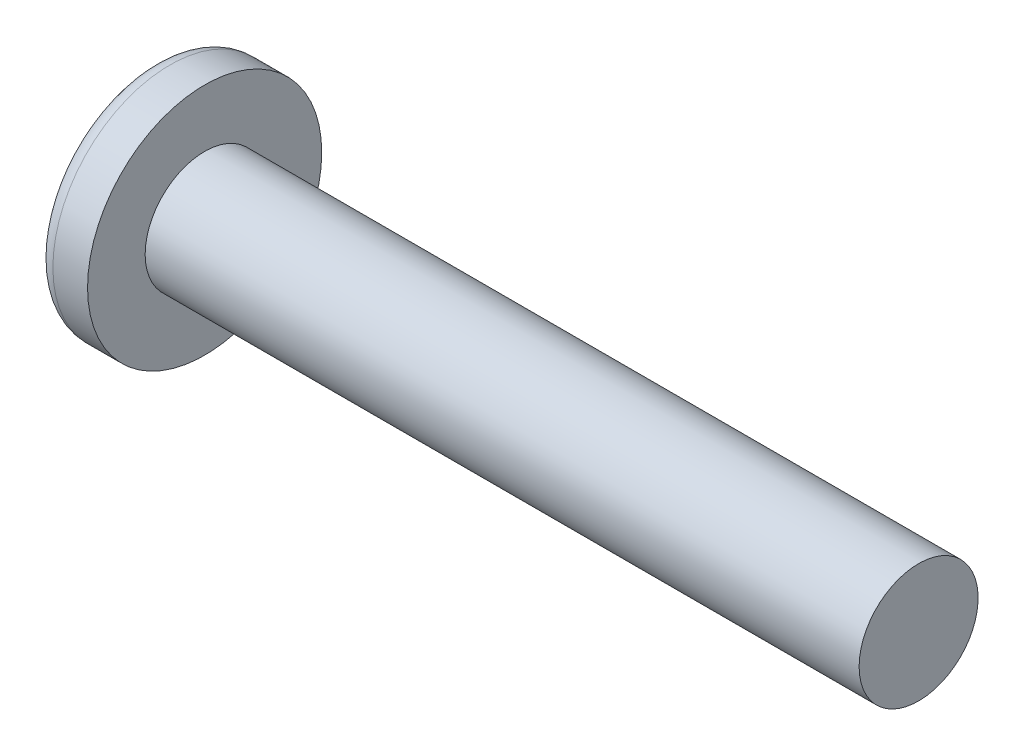
ISO-10303-21;
HEADER;
FILE_DESCRIPTION(('STEP AP214'),'2;1');
FILE_NAME('part.step','',(''),(''),'','','');
FILE_SCHEMA(('AUTOMOTIVE_DESIGN { 1 0 10303 214 1 1 1 1 }'));
ENDSEC;
DATA;
#1=APPLICATION_CONTEXT('core data for automotive mechanical design processes');
#2=APPLICATION_PROTOCOL_DEFINITION('international standard','automotive_design',2000,#1);
#3=PRODUCT_CONTEXT('',#1,'mechanical');
#4=PRODUCT('Part','Part','',(#3));
#5=PRODUCT_RELATED_PRODUCT_CATEGORY('part','',(#4));
#6=PRODUCT_DEFINITION_FORMATION('','',#4);
#7=PRODUCT_DEFINITION_CONTEXT('part definition',#1,'design');
#8=PRODUCT_DEFINITION('design','',#6,#7);
#9=PRODUCT_DEFINITION_SHAPE('','',#8);
#10=(LENGTH_UNIT() NAMED_UNIT(*) SI_UNIT(.MILLI.,.METRE.));
#11=(NAMED_UNIT(*) PLANE_ANGLE_UNIT() SI_UNIT($,.RADIAN.));
#12=(NAMED_UNIT(*) SI_UNIT($,.STERADIAN.) SOLID_ANGLE_UNIT());
#13=UNCERTAINTY_MEASURE_WITH_UNIT(LENGTH_MEASURE(1.E-05),#10,'distance_accuracy_value','');
#14=(GEOMETRIC_REPRESENTATION_CONTEXT(3) GLOBAL_UNCERTAINTY_ASSIGNED_CONTEXT((#13)) GLOBAL_UNIT_ASSIGNED_CONTEXT((#10,
#11,#12)) REPRESENTATION_CONTEXT('',''));
#15=CARTESIAN_POINT('',(0.,0.,0.));
#16=DIRECTION('',(0.,0.,1.));
#17=DIRECTION('',(1.,0.,0.));
#18=AXIS2_PLACEMENT_3D('',#15,#16,#17);
#19=CARTESIAN_POINT('',(10.1599999999999,0.,0.));
#20=DIRECTION('',(-1.,0.,0.));
#21=DIRECTION('',(0.,1.,0.));
#22=AXIS2_PLACEMENT_3D('',#19,#20,#21);
#23=SPHERICAL_SURFACE('',#22,10.16);
#24=CARTESIAN_POINT('',(1.8696580223605,0.,0.));
#25=DIRECTION('',(-1.,0.,0.));
#26=DIRECTION('',(0.,0.,1.));
#27=AXIS2_PLACEMENT_3D('',#24,#25,#26);
#28=CIRCLE('',#27,5.87331506849315);
#29=CARTESIAN_POINT('',(1.8696580223605,0.,5.87331506849315));
#30=VERTEX_POINT('',#29);
#31=EDGE_CURVE('E174',#30,#30,#28,.T.);
#32=ORIENTED_EDGE('',*,*,#31,.T.);
#33=EDGE_LOOP('',(#32));
#34=FACE_BOUND('',#33,.T.);
#35=CARTESIAN_POINT('',(10.1534494829081,-0.0813167639009404,0.));
#36=DIRECTION('',(-0.0802954503227799,-0.996771107455198,0.));
#37=DIRECTION('',(0.996771107455198,-0.0802954503227799,0.));
#38=AXIS2_PLACEMENT_3D('',#35,#36,#37);
#39=CIRCLE('',#38,10.159672468866);
#40=CARTESIAN_POINT('',(0.652039536999327,0.684074592852801,3.51515714946449));
#41=VERTEX_POINT('',#40);
#42=CARTESIAN_POINT('',(0.0529249432221768,0.732336601796002,0.732336601795947));
#43=VERTEX_POINT('',#42);
#44=EDGE_CURVE('E205',#41,#43,#39,.T.);
#45=ORIENTED_EDGE('',*,*,#44,.F.);
#46=CARTESIAN_POINT('',(8.14988642132874,0.,-2.50394771045559));
#47=DIRECTION('',(0.626014972056276,0.,0.779811037855569));
#48=DIRECTION('',(0.779811037855569,0.,-0.626014972056276));
#49=AXIS2_PLACEMENT_3D('',#46,#47,#48);
#50=CIRCLE('',#49,9.63925771333798);
#51=CARTESIAN_POINT('',(0.652039536999327,-0.684074592852857,3.51515714946449));
#52=VERTEX_POINT('',#51);
#53=EDGE_CURVE('E170',#41,#52,#50,.T.);
#54=ORIENTED_EDGE('',*,*,#53,.T.);
#55=CARTESIAN_POINT('',(10.1534494829081,0.0813167639009404,0.));
#56=DIRECTION('',(-0.0802954503227798,0.996771107455198,0.));
#57=DIRECTION('',(-0.996771107455198,-0.0802954503227798,0.));
#58=AXIS2_PLACEMENT_3D('',#55,#56,#57);
#59=CIRCLE('',#58,10.159672468866);
#60=CARTESIAN_POINT('',(0.0529249432221768,-0.732336601796002,0.732336601795947));
#61=VERTEX_POINT('',#60);
#62=EDGE_CURVE('E126',#61,#52,#59,.T.);
#63=ORIENTED_EDGE('',*,*,#62,.F.);
#64=CARTESIAN_POINT('',(10.1534494829081,0.,-0.0813167639008849));
#65=DIRECTION('',(-0.0802954503227798,0.,-0.996771107455198));
#66=DIRECTION('',(-0.996771107455198,0.,0.0802954503227798));
#67=AXIS2_PLACEMENT_3D('',#64,#65,#66);
#68=CIRCLE('',#67,10.159672468866);
#69=CARTESIAN_POINT('',(0.652039536999327,-3.51515714946438,0.68407459285269));
#70=VERTEX_POINT('',#69);
#71=EDGE_CURVE('E151',#70,#61,#68,.T.);
#72=ORIENTED_EDGE('',*,*,#71,.F.);
#73=CARTESIAN_POINT('',(8.14988642132874,2.50394771045559,0.));
#74=DIRECTION('',(0.626014972056276,-0.779811037855569,0.));
#75=DIRECTION('',(0.779811037855569,0.626014972056276,0.));
#76=AXIS2_PLACEMENT_3D('',#73,#74,#75);
#77=CIRCLE('',#76,9.63925771333798);
#78=CARTESIAN_POINT('',(0.652039536999327,-3.51515714946438,-0.68407459285269));
#79=VERTEX_POINT('',#78);
#80=EDGE_CURVE('E159',#70,#79,#77,.T.);
#81=ORIENTED_EDGE('',*,*,#80,.T.);
#82=CARTESIAN_POINT('',(10.1534494829081,0.,0.0813167639008849));
#83=DIRECTION('',(-0.0802954503227799,0.,0.996771107455198));
#84=DIRECTION('',(0.996771107455198,0.,0.0802954503227799));
#85=AXIS2_PLACEMENT_3D('',#82,#83,#84);
#86=CIRCLE('',#85,10.159672468866);
#87=CARTESIAN_POINT('',(0.0529249432221768,-0.732336601796002,-0.732336601795947));
#88=VERTEX_POINT('',#87);
#89=EDGE_CURVE('E69',#88,#79,#86,.T.);
#90=ORIENTED_EDGE('',*,*,#89,.F.);
#91=CARTESIAN_POINT('',(0.652039536999327,-0.684074592852801,-3.51515714946449));
#92=VERTEX_POINT('',#91);
#93=EDGE_CURVE('E212',#92,#88,#59,.T.);
#94=ORIENTED_EDGE('',*,*,#93,.F.);
#95=CARTESIAN_POINT('',(8.14988642132874,0.,2.50394771045559));
#96=DIRECTION('',(0.626014972056276,0.,-0.779811037855569));
#97=DIRECTION('',(-0.779811037855569,0.,-0.626014972056276));
#98=AXIS2_PLACEMENT_3D('',#95,#96,#97);
#99=CIRCLE('',#98,9.63925771333798);
#100=CARTESIAN_POINT('',(0.652039536999327,0.684074592852857,-3.51515714946449));
#101=VERTEX_POINT('',#100);
#102=EDGE_CURVE('E152',#92,#101,#99,.T.);
#103=ORIENTED_EDGE('',*,*,#102,.T.);
#104=CARTESIAN_POINT('',(0.0529249432221768,0.732336601796002,-0.732336601795947));
#105=VERTEX_POINT('',#104);
#106=EDGE_CURVE('E200',#105,#101,#39,.T.);
#107=ORIENTED_EDGE('',*,*,#106,.F.);
#108=CARTESIAN_POINT('',(0.652039536999327,3.51515714946438,-0.68407459285269));
#109=VERTEX_POINT('',#108);
#110=EDGE_CURVE('E62',#109,#105,#86,.T.);
#111=ORIENTED_EDGE('',*,*,#110,.F.);
#112=CARTESIAN_POINT('',(8.14988642132874,-2.50394771045559,0.));
#113=DIRECTION('',(0.626014972056276,0.779811037855569,0.));
#114=DIRECTION('',(-0.779811037855569,0.626014972056276,0.));
#115=AXIS2_PLACEMENT_3D('',#112,#113,#114);
#116=CIRCLE('',#115,9.63925771333798);
#117=CARTESIAN_POINT('',(0.652039536999327,3.51515714946438,0.68407459285269));
#118=VERTEX_POINT('',#117);
#119=EDGE_CURVE('E13',#109,#118,#116,.T.);
#120=ORIENTED_EDGE('',*,*,#119,.T.);
#121=EDGE_CURVE('E188',#43,#118,#68,.T.);
#122=ORIENTED_EDGE('',*,*,#121,.F.);
#123=EDGE_LOOP('',(#45,#54,#63,#72,#81,#90,#94,#103,#107,#111,#120,#122));
#124=FACE_BOUND('',#123,.T.);
#125=ADVANCED_FACE('F54',(#34,#124),#23,.T.);
#126=CARTESIAN_POINT('',(5.03078200692042,0.,-0.33134256055356));
#127=DIRECTION('',(-0.0802954503227799,0.,0.996771107455198));
#128=DIRECTION('',(0.996771107455198,0.,0.0802954503227799));
#129=AXIS2_PLACEMENT_3D('',#126,#127,#128);
#130=PLANE('',#129);
#131=ORIENTED_EDGE('',*,*,#110,.T.);
#132=DIRECTION('',(0.993573291519185,-0.0800378484834902,0.08003784848349));
#133=VECTOR('',#132,1.);
#134=CARTESIAN_POINT('',(5.05713151661857,0.329219961161309,-0.329219961161309));
#135=LINE('',#134,#133);
#136=CARTESIAN_POINT('',(4.57200000000002,0.368299999999988,-0.368300000000099));
#137=VERTEX_POINT('',#136);
#138=EDGE_CURVE('E194',#105,#137,#135,.T.);
#139=ORIENTED_EDGE('',*,*,#138,.T.);
#140=DIRECTION('',(0.778276964525241,-0.624783452077207,0.0626945332534222));
#141=VECTOR('',#140,1.);
#142=CARTESIAN_POINT('',(0.,4.0386,-0.736599999999976));
#143=LINE('',#142,#141);
#144=EDGE_CURVE('E175',#109,#137,#143,.T.);
#145=ORIENTED_EDGE('',*,*,#144,.F.);
#146=EDGE_LOOP('',(#131,#139,#145));
#147=FACE_BOUND('',#146,.T.);
#148=ADVANCED_FACE('F193',(#147),#130,.T.);
#149=DIRECTION('',(0.778276964525241,0.624783452077207,0.0626945332534222));
#150=VECTOR('',#149,1.);
#151=CARTESIAN_POINT('',(0.,-4.0386,-0.736599999999976));
#152=LINE('',#151,#150);
#153=CARTESIAN_POINT('',(4.57200000000002,-0.368299999999988,-0.368300000000099));
#154=VERTEX_POINT('',#153);
#155=EDGE_CURVE('E160',#79,#154,#152,.T.);
#156=ORIENTED_EDGE('',*,*,#155,.T.);
#157=DIRECTION('',(-0.993573291519185,-0.0800378484834896,-0.08003784848349));
#158=VECTOR('',#157,1.);
#159=CARTESIAN_POINT('',(5.05713151661857,-0.329219961161309,-0.329219961161309));
#160=LINE('',#159,#158);
#161=EDGE_CURVE('E215',#154,#88,#160,.T.);
#162=ORIENTED_EDGE('',*,*,#161,.T.);
#163=ORIENTED_EDGE('',*,*,#89,.T.);
#164=EDGE_LOOP('',(#156,#162,#163));
#165=FACE_BOUND('',#164,.T.);
#166=ADVANCED_FACE('F230',(#165),#130,.T.);
#167=CARTESIAN_POINT('',(5.03078200692042,0.,0.33134256055356));
#168=DIRECTION('',(-0.0802954503227798,0.,-0.996771107455198));
#169=DIRECTION('',(-0.996771107455198,0.,0.0802954503227798));
#170=AXIS2_PLACEMENT_3D('',#167,#168,#169);
#171=PLANE('',#170);
#172=DIRECTION('',(0.778276964525241,-0.624783452077207,-0.0626945332534223));
#173=VECTOR('',#172,1.);
#174=CARTESIAN_POINT('',(0.,4.0386,0.736599999999976));
#175=LINE('',#174,#173);
#176=CARTESIAN_POINT('',(4.57200000000002,0.368299999999988,0.368300000000099));
#177=VERTEX_POINT('',#176);
#178=EDGE_CURVE('E231',#118,#177,#175,.T.);
#179=ORIENTED_EDGE('',*,*,#178,.T.);
#180=DIRECTION('',(-0.993573291519185,0.0800378484834897,0.0800378484834899));
#181=VECTOR('',#180,1.);
#182=CARTESIAN_POINT('',(5.05713151661857,0.329219961161309,0.329219961161309));
#183=LINE('',#182,#181);
#184=EDGE_CURVE('E209',#177,#43,#183,.T.);
#185=ORIENTED_EDGE('',*,*,#184,.T.);
#186=ORIENTED_EDGE('',*,*,#121,.T.);
#187=EDGE_LOOP('',(#179,#185,#186));
#188=FACE_BOUND('',#187,.T.);
#189=ADVANCED_FACE('F235',(#188),#171,.T.);
#190=ORIENTED_EDGE('',*,*,#71,.T.);
#191=DIRECTION('',(0.993573291519185,0.0800378484834902,-0.0800378484834899));
#192=VECTOR('',#191,1.);
#193=CARTESIAN_POINT('',(5.05713151661857,-0.329219961161309,0.329219961161309));
#194=LINE('',#193,#192);
#195=CARTESIAN_POINT('',(4.57200000000002,-0.368299999999988,0.368300000000099));
#196=VERTEX_POINT('',#195);
#197=EDGE_CURVE('E124',#61,#196,#194,.T.);
#198=ORIENTED_EDGE('',*,*,#197,.T.);
#199=DIRECTION('',(0.778276964525241,0.624783452077207,-0.0626945332534221));
#200=VECTOR('',#199,1.);
#201=CARTESIAN_POINT('',(0.,-4.0386,0.736599999999976));
#202=LINE('',#201,#200);
#203=EDGE_CURVE('E149',#70,#196,#202,.T.);
#204=ORIENTED_EDGE('',*,*,#203,.F.);
#205=EDGE_LOOP('',(#190,#198,#204));
#206=FACE_BOUND('',#205,.T.);
#207=ADVANCED_FACE('F148',(#206),#171,.T.);
#208=CARTESIAN_POINT('',(-25.4000000000001,0.,0.));
#209=DIRECTION('',(-1.,0.,0.));
#210=DIRECTION('',(0.,0.,1.));
#211=AXIS2_PLACEMENT_3D('',#208,#209,#210);
#212=CYLINDRICAL_SURFACE('',#211,3.175);
#213=CARTESIAN_POINT('',(42.5450000000001,0.,0.));
#214=DIRECTION('',(-1.,0.,0.));
#215=DIRECTION('',(0.,0.,1.));
#216=AXIS2_PLACEMENT_3D('',#213,#214,#215);
#217=CIRCLE('',#216,3.175);
#218=CARTESIAN_POINT('',(42.5450000000001,0.,3.175));
#219=VERTEX_POINT('',#218);
#220=EDGE_CURVE('E171',#219,#219,#217,.T.);
#221=ORIENTED_EDGE('',*,*,#220,.T.);
#222=EDGE_LOOP('',(#221));
#223=FACE_BOUND('',#222,.T.);
#224=CARTESIAN_POINT('',(4.44500000000003,0.,0.));
#225=DIRECTION('',(-1.,0.,0.));
#226=DIRECTION('',(0.,0.,1.));
#227=AXIS2_PLACEMENT_3D('',#224,#225,#226);
#228=CIRCLE('',#227,3.175);
#229=CARTESIAN_POINT('',(4.44500000000003,0.,3.175));
#230=VERTEX_POINT('',#229);
#231=EDGE_CURVE('E184',#230,#230,#228,.T.);
#232=ORIENTED_EDGE('',*,*,#231,.F.);
#233=EDGE_LOOP('',(#232));
#234=FACE_BOUND('',#233,.T.);
#235=ADVANCED_FACE('F56',(#223,#234),#212,.T.);
#236=CARTESIAN_POINT('',(4.44500000000003,3.17499999999998,0.));
#237=DIRECTION('',(-1.,0.,0.));
#238=DIRECTION('',(0.,0.,1.));
#239=AXIS2_PLACEMENT_3D('',#236,#237,#238);
#240=PLANE('',#239);
#241=CARTESIAN_POINT('',(4.44500000000003,0.,0.));
#242=DIRECTION('',(-1.,0.,0.));
#243=DIRECTION('',(0.,0.,1.));
#244=AXIS2_PLACEMENT_3D('',#241,#242,#243);
#245=CIRCLE('',#244,6.2484);
#246=CARTESIAN_POINT('',(4.44500000000003,0.,6.2484));
#247=VERTEX_POINT('',#246);
#248=EDGE_CURVE('E181',#247,#247,#245,.T.);
#249=ORIENTED_EDGE('',*,*,#248,.F.);
#250=EDGE_LOOP('',(#249));
#251=FACE_BOUND('',#250,.T.);
#252=ORIENTED_EDGE('',*,*,#231,.T.);
#253=EDGE_LOOP('',(#252));
#254=FACE_BOUND('',#253,.T.);
#255=ADVANCED_FACE('F263',(#251,#254),#240,.F.);
#256=CARTESIAN_POINT('',(-25.4000000000001,0.,0.));
#257=DIRECTION('',(-1.,0.,0.));
#258=DIRECTION('',(0.,0.,1.));
#259=AXIS2_PLACEMENT_3D('',#256,#257,#258);
#260=CYLINDRICAL_SURFACE('',#259,6.2484);
#261=ORIENTED_EDGE('',*,*,#248,.T.);
#262=EDGE_LOOP('',(#261));
#263=FACE_BOUND('',#262,.T.);
#264=CARTESIAN_POINT('',(2.5950629454039,0.,0.));
#265=DIRECTION('',(-1.,0.,0.));
#266=DIRECTION('',(0.,0.,1.));
#267=AXIS2_PLACEMENT_3D('',#264,#265,#266);
#268=CIRCLE('',#267,6.2484);
#269=CARTESIAN_POINT('',(2.5950629454039,0.,6.2484));
#270=VERTEX_POINT('',#269);
#271=EDGE_CURVE('E178',#270,#270,#268,.T.);
#272=ORIENTED_EDGE('',*,*,#271,.F.);
#273=EDGE_LOOP('',(#272));
#274=FACE_BOUND('',#273,.T.);
#275=ADVANCED_FACE('F260',(#263,#274),#260,.T.);
#276=CARTESIAN_POINT('',(2.5950629454039,0.,0.));
#277=DIRECTION('',(-1.,0.,0.));
#278=DIRECTION('',(0.,0.,1.));
#279=AXIS2_PLACEMENT_3D('',#276,#277,#278);
#280=TOROIDAL_SURFACE('',#279,5.3594,0.888999999999999);
#281=ORIENTED_EDGE('',*,*,#271,.T.);
#282=EDGE_LOOP('',(#281));
#283=FACE_BOUND('',#282,.T.);
#284=ORIENTED_EDGE('',*,*,#31,.F.);
#285=EDGE_LOOP('',(#284));
#286=FACE_BOUND('',#285,.T.);
#287=ADVANCED_FACE('F257',(#283,#286),#280,.T.);
#288=CARTESIAN_POINT('',(42.5450000000001,3.17499999999998,0.));
#289=DIRECTION('',(1.,0.,0.));
#290=DIRECTION('',(0.,0.,-1.));
#291=AXIS2_PLACEMENT_3D('',#288,#289,#290);
#292=PLANE('',#291);
#293=ORIENTED_EDGE('',*,*,#220,.F.);
#294=EDGE_LOOP('',(#293));
#295=FACE_BOUND('',#294,.T.);
#296=ADVANCED_FACE('F255',(#295),#292,.T.);
#297=CARTESIAN_POINT('',(4.57200000000002,0.368299999999988,0.368300000000099));
#298=DIRECTION('',(0.626014972056276,0.779811037855569,0.));
#299=DIRECTION('',(-0.779811037855569,0.626014972056276,0.));
#300=AXIS2_PLACEMENT_3D('',#297,#298,#299);
#301=PLANE('',#300);
#302=ORIENTED_EDGE('',*,*,#144,.T.);
#303=DIRECTION('',(0.,0.,-1.));
#304=VECTOR('',#303,1.);
#305=CARTESIAN_POINT('',(4.57200000000002,0.368299999999988,0.368300000000099));
#306=LINE('',#305,#304);
#307=EDGE_CURVE('E142',#177,#137,#306,.T.);
#308=ORIENTED_EDGE('',*,*,#307,.F.);
#309=ORIENTED_EDGE('',*,*,#178,.F.);
#310=ORIENTED_EDGE('',*,*,#119,.F.);
#311=EDGE_LOOP('',(#302,#308,#309,#310));
#312=FACE_BOUND('',#311,.T.);
#313=ADVANCED_FACE('F234',(#312),#301,.F.);
#314=CARTESIAN_POINT('',(4.57200000000002,-0.368299999999988,-0.368300000000099));
#315=DIRECTION('',(0.626014972056276,-0.779811037855569,0.));
#316=DIRECTION('',(0.779811037855569,0.626014972056276,0.));
#317=AXIS2_PLACEMENT_3D('',#314,#315,#316);
#318=PLANE('',#317);
#319=ORIENTED_EDGE('',*,*,#203,.T.);
#320=DIRECTION('',(0.,0.,1.));
#321=VECTOR('',#320,1.);
#322=CARTESIAN_POINT('',(4.57200000000002,-0.368299999999988,-0.368300000000099));
#323=LINE('',#322,#321);
#324=EDGE_CURVE('E141',#154,#196,#323,.T.);
#325=ORIENTED_EDGE('',*,*,#324,.F.);
#326=ORIENTED_EDGE('',*,*,#155,.F.);
#327=ORIENTED_EDGE('',*,*,#80,.F.);
#328=EDGE_LOOP('',(#319,#325,#326,#327));
#329=FACE_BOUND('',#328,.T.);
#330=ADVANCED_FACE('F156',(#329),#318,.F.);
#331=CARTESIAN_POINT('',(4.57200000000002,0.368299999999988,-0.368300000000099));
#332=DIRECTION('',(-1.,0.,0.));
#333=DIRECTION('',(0.,0.,1.));
#334=AXIS2_PLACEMENT_3D('',#331,#332,#333);
#335=PLANE('',#334);
#336=DIRECTION('',(0.,1.,0.));
#337=VECTOR('',#336,1.);
#338=CARTESIAN_POINT('',(4.57200000000002,-0.368299999999988,-0.368300000000099));
#339=LINE('',#338,#337);
#340=EDGE_CURVE('E164',#154,#137,#339,.T.);
#341=ORIENTED_EDGE('',*,*,#340,.F.);
#342=ORIENTED_EDGE('',*,*,#324,.T.);
#343=DIRECTION('',(0.,-1.,0.));
#344=VECTOR('',#343,1.);
#345=CARTESIAN_POINT('',(4.57200000000002,0.368299999999988,0.368300000000099));
#346=LINE('',#345,#344);
#347=EDGE_CURVE('E133',#177,#196,#346,.T.);
#348=ORIENTED_EDGE('',*,*,#347,.F.);
#349=ORIENTED_EDGE('',*,*,#307,.T.);
#350=EDGE_LOOP('',(#341,#342,#348,#349));
#351=FACE_BOUND('',#350,.T.);
#352=ADVANCED_FACE('F162',(#351),#335,.T.);
#353=CARTESIAN_POINT('',(4.57200000000002,0.368299999999988,-0.368300000000099));
#354=DIRECTION('',(0.626014972056276,0.,-0.779811037855569));
#355=DIRECTION('',(0.779811037855569,0.,0.626014972056276));
#356=AXIS2_PLACEMENT_3D('',#353,#354,#355);
#357=PLANE('',#356);
#358=DIRECTION('',(0.778276964525241,0.06269453325342,0.624783452077208));
#359=VECTOR('',#358,1.);
#360=CARTESIAN_POINT('',(0.,-0.736599999999976,-4.03860000000011));
#361=LINE('',#360,#359);
#362=EDGE_CURVE('E220',#92,#154,#361,.T.);
#363=ORIENTED_EDGE('',*,*,#362,.T.);
#364=ORIENTED_EDGE('',*,*,#340,.T.);
#365=DIRECTION('',(0.778276964525241,-0.0626945332534244,0.624783452077207));
#366=VECTOR('',#365,1.);
#367=CARTESIAN_POINT('',(0.,0.736600000000032,-4.03860000000011));
#368=LINE('',#367,#366);
#369=EDGE_CURVE('E130',#101,#137,#368,.T.);
#370=ORIENTED_EDGE('',*,*,#369,.F.);
#371=ORIENTED_EDGE('',*,*,#102,.F.);
#372=EDGE_LOOP('',(#363,#364,#370,#371));
#373=FACE_BOUND('',#372,.T.);
#374=ADVANCED_FACE('F225',(#373),#357,.F.);
#375=CARTESIAN_POINT('',(5.03078200692042,-0.331342560553616,0.));
#376=DIRECTION('',(-0.0802954503227798,0.996771107455198,0.));
#377=DIRECTION('',(-0.996771107455198,-0.0802954503227798,0.));
#378=AXIS2_PLACEMENT_3D('',#375,#376,#377);
#379=PLANE('',#378);
#380=ORIENTED_EDGE('',*,*,#93,.T.);
#381=ORIENTED_EDGE('',*,*,#161,.F.);
#382=ORIENTED_EDGE('',*,*,#362,.F.);
#383=EDGE_LOOP('',(#380,#381,#382));
#384=FACE_BOUND('',#383,.T.);
#385=ADVANCED_FACE('F229',(#384),#379,.T.);
#386=CARTESIAN_POINT('',(5.03078200692042,0.331342560553616,0.));
#387=DIRECTION('',(-0.0802954503227799,-0.996771107455198,0.));
#388=DIRECTION('',(0.996771107455198,-0.0802954503227799,0.));
#389=AXIS2_PLACEMENT_3D('',#386,#387,#388);
#390=PLANE('',#389);
#391=ORIENTED_EDGE('',*,*,#106,.T.);
#392=ORIENTED_EDGE('',*,*,#369,.T.);
#393=ORIENTED_EDGE('',*,*,#138,.F.);
#394=EDGE_LOOP('',(#391,#392,#393));
#395=FACE_BOUND('',#394,.T.);
#396=ADVANCED_FACE('F223',(#395),#390,.T.);
#397=CARTESIAN_POINT('',(4.57200000000002,-0.368299999999988,0.368300000000099));
#398=DIRECTION('',(0.626014972056276,0.,0.779811037855569));
#399=DIRECTION('',(-0.779811037855569,0.,0.626014972056276));
#400=AXIS2_PLACEMENT_3D('',#397,#398,#399);
#401=PLANE('',#400);
#402=DIRECTION('',(0.778276964525241,-0.06269453325342,-0.624783452077208));
#403=VECTOR('',#402,1.);
#404=CARTESIAN_POINT('',(0.,0.736599999999976,4.03860000000011));
#405=LINE('',#404,#403);
#406=EDGE_CURVE('E129',#41,#177,#405,.T.);
#407=ORIENTED_EDGE('',*,*,#406,.T.);
#408=ORIENTED_EDGE('',*,*,#347,.T.);
#409=DIRECTION('',(0.778276964525241,0.0626945332534244,-0.624783452077207));
#410=VECTOR('',#409,1.);
#411=CARTESIAN_POINT('',(0.,-0.736600000000032,4.03860000000011));
#412=LINE('',#411,#410);
#413=EDGE_CURVE('E120',#52,#196,#412,.T.);
#414=ORIENTED_EDGE('',*,*,#413,.F.);
#415=ORIENTED_EDGE('',*,*,#53,.F.);
#416=EDGE_LOOP('',(#407,#408,#414,#415));
#417=FACE_BOUND('',#416,.T.);
#418=ADVANCED_FACE('F134',(#417),#401,.F.);
#419=ORIENTED_EDGE('',*,*,#44,.T.);
#420=ORIENTED_EDGE('',*,*,#184,.F.);
#421=ORIENTED_EDGE('',*,*,#406,.F.);
#422=EDGE_LOOP('',(#419,#420,#421));
#423=FACE_BOUND('',#422,.T.);
#424=ADVANCED_FACE('F236',(#423),#390,.T.);
#425=ORIENTED_EDGE('',*,*,#62,.T.);
#426=ORIENTED_EDGE('',*,*,#413,.T.);
#427=ORIENTED_EDGE('',*,*,#197,.F.);
#428=EDGE_LOOP('',(#425,#426,#427));
#429=FACE_BOUND('',#428,.T.);
#430=ADVANCED_FACE('F122',(#429),#379,.T.);
#431=CLOSED_SHELL('',(#125,#148,#166,#189,#207,#235,#255,#275,#287,#296,#313,#330,#352,#374,
#385,#396,#418,#424,#430));
#432=MANIFOLD_SOLID_BREP('B2',#431);
#433=ADVANCED_BREP_SHAPE_REPRESENTATION('',(#18,#432),#14);
#434=SHAPE_DEFINITION_REPRESENTATION(#9,#433);
ENDSEC;
END-ISO-10303-21;
